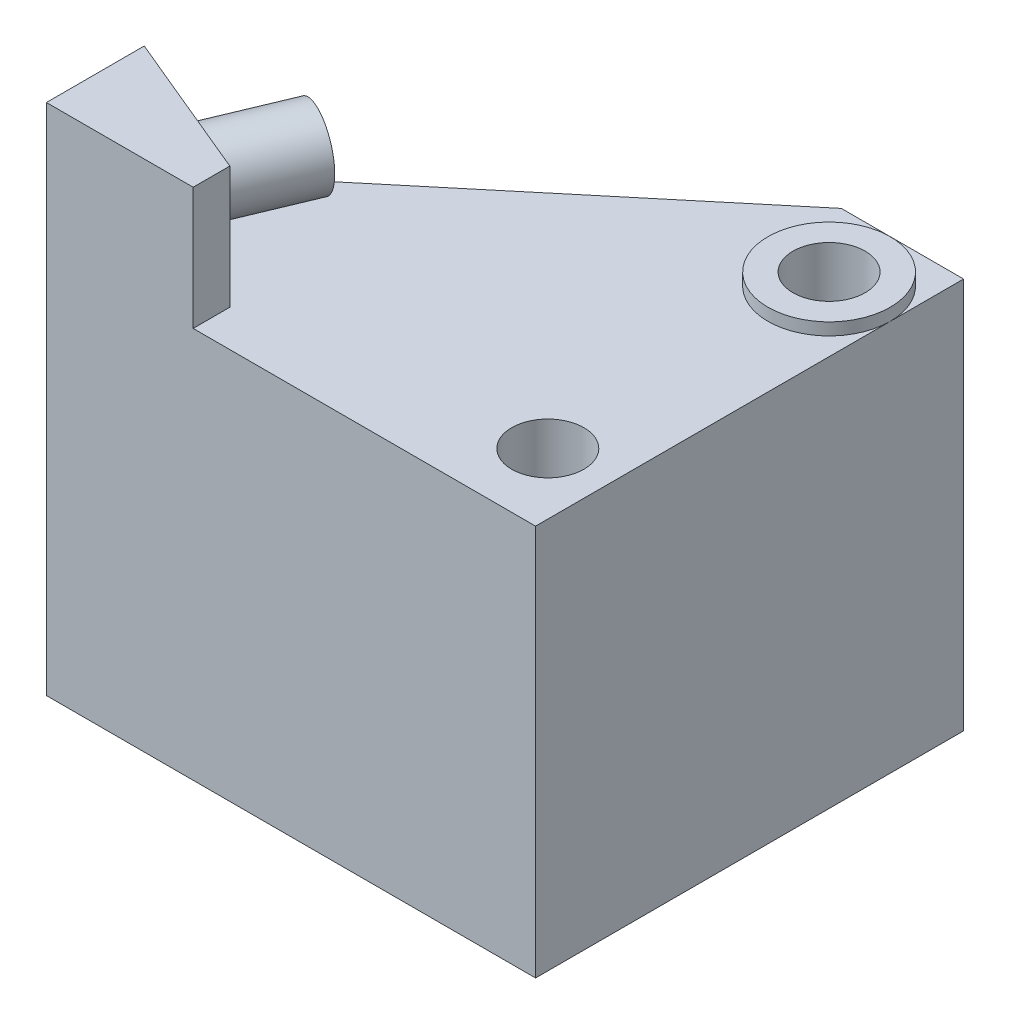
ISO-10303-21;
HEADER;
FILE_DESCRIPTION(('STEP AP214'),'2;1');
FILE_NAME('part.step','',(''),(''),'','','');
FILE_SCHEMA(('AUTOMOTIVE_DESIGN { 1 0 10303 214 1 1 1 1 }'));
ENDSEC;
DATA;
#1=APPLICATION_CONTEXT('core data for automotive mechanical design processes');
#2=APPLICATION_PROTOCOL_DEFINITION('international standard','automotive_design',2000,#1);
#3=PRODUCT_CONTEXT('',#1,'mechanical');
#4=PRODUCT('Part','Part','',(#3));
#5=PRODUCT_RELATED_PRODUCT_CATEGORY('part','',(#4));
#6=PRODUCT_DEFINITION_FORMATION('','',#4);
#7=PRODUCT_DEFINITION_CONTEXT('part definition',#1,'design');
#8=PRODUCT_DEFINITION('design','',#6,#7);
#9=PRODUCT_DEFINITION_SHAPE('','',#8);
#10=(LENGTH_UNIT() NAMED_UNIT(*) SI_UNIT(.MILLI.,.METRE.));
#11=(NAMED_UNIT(*) PLANE_ANGLE_UNIT() SI_UNIT($,.RADIAN.));
#12=(NAMED_UNIT(*) SI_UNIT($,.STERADIAN.) SOLID_ANGLE_UNIT());
#13=UNCERTAINTY_MEASURE_WITH_UNIT(LENGTH_MEASURE(1.E-05),#10,'distance_accuracy_value','');
#14=(GEOMETRIC_REPRESENTATION_CONTEXT(3) GLOBAL_UNCERTAINTY_ASSIGNED_CONTEXT((#13)) GLOBAL_UNIT_ASSIGNED_CONTEXT((#10,
#11,#12)) REPRESENTATION_CONTEXT('',''));
#15=CARTESIAN_POINT('',(0.,0.,0.));
#16=DIRECTION('',(0.,0.,1.));
#17=DIRECTION('',(1.,0.,0.));
#18=AXIS2_PLACEMENT_3D('',#15,#16,#17);
#19=CARTESIAN_POINT('',(0.,16.,0.));
#20=DIRECTION('',(0.,-1.,0.));
#21=DIRECTION('',(0.,0.,-1.));
#22=AXIS2_PLACEMENT_3D('',#19,#20,#21);
#23=PLANE('',#22);
#24=CARTESIAN_POINT('',(-2.5,16.,-3.));
#25=DIRECTION('',(0.,1.,0.));
#26=DIRECTION('',(0.,0.,1.));
#27=AXIS2_PLACEMENT_3D('',#24,#25,#26);
#28=CIRCLE('',#27,1.475);
#29=CARTESIAN_POINT('',(-2.5,16.,-1.525));
#30=VERTEX_POINT('',#29);
#31=EDGE_CURVE('E177',#30,#30,#28,.T.);
#32=ORIENTED_EDGE('',*,*,#31,.F.);
#33=EDGE_LOOP('',(#32));
#34=FACE_BOUND('',#33,.T.);
#35=DIRECTION('',(0.,0.,-1.));
#36=VECTOR('',#35,1.);
#37=CARTESIAN_POINT('',(0.,16.,-17.5));
#38=LINE('',#37,#36);
#39=CARTESIAN_POINT('',(0.,16.,0.));
#40=VERTEX_POINT('',#39);
#41=CARTESIAN_POINT('',(0.,16.,-14.5));
#42=VERTEX_POINT('',#41);
#43=EDGE_CURVE('E107',#40,#42,#38,.T.);
#44=ORIENTED_EDGE('',*,*,#43,.T.);
#45=CARTESIAN_POINT('',(-2.5,16.,-14.5));
#46=DIRECTION('',(0.,1.,0.));
#47=DIRECTION('',(0.,0.,1.));
#48=AXIS2_PLACEMENT_3D('',#45,#46,#47);
#49=CIRCLE('',#48,2.5);
#50=EDGE_CURVE('E110',#42,#42,#49,.T.);
#51=ORIENTED_EDGE('',*,*,#50,.F.);
#52=CARTESIAN_POINT('',(0.,16.,-17.5));
#53=VERTEX_POINT('',#52);
#54=EDGE_CURVE('E116',#42,#53,#38,.T.);
#55=ORIENTED_EDGE('',*,*,#54,.T.);
#56=DIRECTION('',(-1.,0.,0.));
#57=VECTOR('',#56,1.);
#58=CARTESIAN_POINT('',(-5.,16.,-17.5));
#59=LINE('',#58,#57);
#60=CARTESIAN_POINT('',(-5.,16.,-17.5));
#61=VERTEX_POINT('',#60);
#62=EDGE_CURVE('E115',#53,#61,#59,.T.);
#63=ORIENTED_EDGE('',*,*,#62,.T.);
#64=DIRECTION('',(-0.768221279597376,0.,0.64018439966448));
#65=VECTOR('',#64,1.);
#66=CARTESIAN_POINT('',(-20.,16.,-5.));
#67=LINE('',#66,#65);
#68=CARTESIAN_POINT('',(-20.,16.,-5.));
#69=VERTEX_POINT('',#68);
#70=EDGE_CURVE('E127',#61,#69,#67,.T.);
#71=ORIENTED_EDGE('',*,*,#70,.T.);
#72=DIRECTION('',(0.,0.,1.));
#73=VECTOR('',#72,1.);
#74=CARTESIAN_POINT('',(-20.,16.,0.));
#75=LINE('',#74,#73);
#76=CARTESIAN_POINT('',(-20.,16.,-4.));
#77=VERTEX_POINT('',#76);
#78=EDGE_CURVE('E62',#69,#77,#75,.T.);
#79=ORIENTED_EDGE('',*,*,#78,.T.);
#80=DIRECTION('',(-0.923076923076923,0.,-0.384615384615385));
#81=VECTOR('',#80,1.);
#82=CARTESIAN_POINT('',(-14.,16.,-1.5));
#83=LINE('',#82,#81);
#84=CARTESIAN_POINT('',(-14.,16.,-1.5));
#85=VERTEX_POINT('',#84);
#86=EDGE_CURVE('E192',#85,#77,#83,.T.);
#87=ORIENTED_EDGE('',*,*,#86,.F.);
#88=DIRECTION('',(0.,0.,-1.));
#89=VECTOR('',#88,1.);
#90=CARTESIAN_POINT('',(-14.,16.,0.));
#91=LINE('',#90,#89);
#92=CARTESIAN_POINT('',(-14.,16.,0.));
#93=VERTEX_POINT('',#92);
#94=EDGE_CURVE('E56',#93,#85,#91,.T.);
#95=ORIENTED_EDGE('',*,*,#94,.F.);
#96=DIRECTION('',(1.,0.,0.));
#97=VECTOR('',#96,1.);
#98=CARTESIAN_POINT('',(0.,16.,0.));
#99=LINE('',#98,#97);
#100=EDGE_CURVE('E111',#93,#40,#99,.T.);
#101=ORIENTED_EDGE('',*,*,#100,.T.);
#102=EDGE_LOOP('',(#44,#51,#55,#63,#71,#79,#87,#95,#101));
#103=FACE_BOUND('',#102,.T.);
#104=ADVANCED_FACE('F41',(#34,#103),#23,.F.);
#105=CARTESIAN_POINT('',(-20.,16.,0.));
#106=DIRECTION('',(1.,0.,0.));
#107=DIRECTION('',(0.,0.,-1.));
#108=AXIS2_PLACEMENT_3D('',#105,#106,#107);
#109=PLANE('',#108);
#110=DIRECTION('',(0.,0.,1.));
#111=VECTOR('',#110,1.);
#112=CARTESIAN_POINT('',(-20.,0.,0.));
#113=LINE('',#112,#111);
#114=CARTESIAN_POINT('',(-20.,0.,-5.));
#115=VERTEX_POINT('',#114);
#116=CARTESIAN_POINT('',(-20.,0.,0.));
#117=VERTEX_POINT('',#116);
#118=EDGE_CURVE('E130',#115,#117,#113,.T.);
#119=ORIENTED_EDGE('',*,*,#118,.T.);
#120=DIRECTION('',(0.,-1.,0.));
#121=VECTOR('',#120,1.);
#122=CARTESIAN_POINT('',(-20.,16.,0.));
#123=LINE('',#122,#121);
#124=CARTESIAN_POINT('',(-20.,21.,0.));
#125=VERTEX_POINT('',#124);
#126=EDGE_CURVE('E49',#125,#117,#123,.T.);
#127=ORIENTED_EDGE('',*,*,#126,.F.);
#128=DIRECTION('',(0.,0.,1.));
#129=VECTOR('',#128,1.);
#130=CARTESIAN_POINT('',(-20.,21.,-4.));
#131=LINE('',#130,#129);
#132=CARTESIAN_POINT('',(-20.,21.,-4.));
#133=VERTEX_POINT('',#132);
#134=EDGE_CURVE('E197',#133,#125,#131,.T.);
#135=ORIENTED_EDGE('',*,*,#134,.F.);
#136=DIRECTION('',(0.,-1.,0.));
#137=VECTOR('',#136,1.);
#138=CARTESIAN_POINT('',(-20.,21.,-4.));
#139=LINE('',#138,#137);
#140=EDGE_CURVE('E171',#133,#77,#139,.T.);
#141=ORIENTED_EDGE('',*,*,#140,.T.);
#142=ORIENTED_EDGE('',*,*,#78,.F.);
#143=DIRECTION('',(0.,-1.,0.));
#144=VECTOR('',#143,1.);
#145=CARTESIAN_POINT('',(-20.,16.,-5.));
#146=LINE('',#145,#144);
#147=EDGE_CURVE('E129',#69,#115,#146,.T.);
#148=ORIENTED_EDGE('',*,*,#147,.T.);
#149=EDGE_LOOP('',(#119,#127,#135,#141,#142,#148));
#150=FACE_BOUND('',#149,.T.);
#151=ADVANCED_FACE('F43',(#150),#109,.F.);
#152=CARTESIAN_POINT('',(0.,16.,0.));
#153=DIRECTION('',(0.,0.,-1.));
#154=DIRECTION('',(-1.,0.,0.));
#155=AXIS2_PLACEMENT_3D('',#152,#153,#154);
#156=PLANE('',#155);
#157=DIRECTION('',(1.,0.,0.));
#158=VECTOR('',#157,1.);
#159=CARTESIAN_POINT('',(0.,0.,0.));
#160=LINE('',#159,#158);
#161=CARTESIAN_POINT('',(0.,0.,0.));
#162=VERTEX_POINT('',#161);
#163=EDGE_CURVE('E133',#117,#162,#160,.T.);
#164=ORIENTED_EDGE('',*,*,#163,.T.);
#165=DIRECTION('',(0.,-1.,0.));
#166=VECTOR('',#165,1.);
#167=CARTESIAN_POINT('',(0.,16.,0.));
#168=LINE('',#167,#166);
#169=EDGE_CURVE('E148',#40,#162,#168,.T.);
#170=ORIENTED_EDGE('',*,*,#169,.F.);
#171=ORIENTED_EDGE('',*,*,#100,.F.);
#172=DIRECTION('',(0.,-1.,0.));
#173=VECTOR('',#172,1.);
#174=CARTESIAN_POINT('',(-14.,21.,0.));
#175=LINE('',#174,#173);
#176=CARTESIAN_POINT('',(-14.,21.,0.));
#177=VERTEX_POINT('',#176);
#178=EDGE_CURVE('E183',#177,#93,#175,.T.);
#179=ORIENTED_EDGE('',*,*,#178,.F.);
#180=DIRECTION('',(1.,0.,0.));
#181=VECTOR('',#180,1.);
#182=CARTESIAN_POINT('',(-20.,21.,0.));
#183=LINE('',#182,#181);
#184=EDGE_CURVE('E154',#125,#177,#183,.T.);
#185=ORIENTED_EDGE('',*,*,#184,.F.);
#186=ORIENTED_EDGE('',*,*,#126,.T.);
#187=EDGE_LOOP('',(#164,#170,#171,#179,#185,#186));
#188=FACE_BOUND('',#187,.T.);
#189=ADVANCED_FACE('F152',(#188),#156,.F.);
#190=CARTESIAN_POINT('',(0.,16.,-17.5));
#191=DIRECTION('',(-1.,0.,0.));
#192=DIRECTION('',(0.,0.,1.));
#193=AXIS2_PLACEMENT_3D('',#190,#191,#192);
#194=PLANE('',#193);
#195=DIRECTION('',(0.,0.,-1.));
#196=VECTOR('',#195,1.);
#197=CARTESIAN_POINT('',(0.,0.,-17.5));
#198=LINE('',#197,#196);
#199=CARTESIAN_POINT('',(0.,0.,-17.5));
#200=VERTEX_POINT('',#199);
#201=EDGE_CURVE('E136',#162,#200,#198,.T.);
#202=ORIENTED_EDGE('',*,*,#201,.T.);
#203=DIRECTION('',(0.,-1.,0.));
#204=VECTOR('',#203,1.);
#205=CARTESIAN_POINT('',(0.,16.,-17.5));
#206=LINE('',#205,#204);
#207=EDGE_CURVE('E121',#53,#200,#206,.T.);
#208=ORIENTED_EDGE('',*,*,#207,.F.);
#209=ORIENTED_EDGE('',*,*,#54,.F.);
#210=ORIENTED_EDGE('',*,*,#43,.F.);
#211=ORIENTED_EDGE('',*,*,#169,.T.);
#212=EDGE_LOOP('',(#202,#208,#209,#210,#211));
#213=FACE_BOUND('',#212,.T.);
#214=ADVANCED_FACE('F119',(#213),#194,.F.);
#215=CARTESIAN_POINT('',(-5.,16.,-17.5));
#216=DIRECTION('',(0.,0.,1.));
#217=DIRECTION('',(1.,0.,0.));
#218=AXIS2_PLACEMENT_3D('',#215,#216,#217);
#219=PLANE('',#218);
#220=DIRECTION('',(-1.,0.,0.));
#221=VECTOR('',#220,1.);
#222=CARTESIAN_POINT('',(-5.,0.,-17.5));
#223=LINE('',#222,#221);
#224=CARTESIAN_POINT('',(-5.,0.,-17.5));
#225=VERTEX_POINT('',#224);
#226=EDGE_CURVE('E138',#200,#225,#223,.T.);
#227=ORIENTED_EDGE('',*,*,#226,.T.);
#228=DIRECTION('',(0.,-1.,0.));
#229=VECTOR('',#228,1.);
#230=CARTESIAN_POINT('',(-5.,16.,-17.5));
#231=LINE('',#230,#229);
#232=EDGE_CURVE('E144',#61,#225,#231,.T.);
#233=ORIENTED_EDGE('',*,*,#232,.F.);
#234=ORIENTED_EDGE('',*,*,#62,.F.);
#235=ORIENTED_EDGE('',*,*,#207,.T.);
#236=EDGE_LOOP('',(#227,#233,#234,#235));
#237=FACE_BOUND('',#236,.T.);
#238=ADVANCED_FACE('F165',(#237),#219,.F.);
#239=CARTESIAN_POINT('',(-20.,16.,-5.));
#240=DIRECTION('',(0.64018439966448,0.,0.768221279597376));
#241=DIRECTION('',(0.768221279597376,0.,-0.64018439966448));
#242=AXIS2_PLACEMENT_3D('',#239,#240,#241);
#243=PLANE('',#242);
#244=DIRECTION('',(-0.768221279597376,0.,0.64018439966448));
#245=VECTOR('',#244,1.);
#246=CARTESIAN_POINT('',(-20.,0.,-5.));
#247=LINE('',#246,#245);
#248=EDGE_CURVE('E140',#225,#115,#247,.T.);
#249=ORIENTED_EDGE('',*,*,#248,.T.);
#250=ORIENTED_EDGE('',*,*,#147,.F.);
#251=ORIENTED_EDGE('',*,*,#70,.F.);
#252=ORIENTED_EDGE('',*,*,#232,.T.);
#253=EDGE_LOOP('',(#249,#250,#251,#252));
#254=FACE_BOUND('',#253,.T.);
#255=ADVANCED_FACE('F169',(#254),#243,.F.);
#256=CARTESIAN_POINT('',(0.,0.,0.));
#257=DIRECTION('',(0.,-1.,0.));
#258=DIRECTION('',(0.,0.,-1.));
#259=AXIS2_PLACEMENT_3D('',#256,#257,#258);
#260=PLANE('',#259);
#261=CARTESIAN_POINT('',(-2.5,0.,-14.5));
#262=DIRECTION('',(0.,1.,0.));
#263=DIRECTION('',(0.,0.,1.));
#264=AXIS2_PLACEMENT_3D('',#261,#262,#263);
#265=CIRCLE('',#264,1.475);
#266=CARTESIAN_POINT('',(-2.5,0.,-13.025));
#267=VERTEX_POINT('',#266);
#268=EDGE_CURVE('E134',#267,#267,#265,.T.);
#269=ORIENTED_EDGE('',*,*,#268,.T.);
#270=EDGE_LOOP('',(#269));
#271=FACE_BOUND('',#270,.T.);
#272=CARTESIAN_POINT('',(-2.5,0.,-3.));
#273=DIRECTION('',(0.,1.,0.));
#274=DIRECTION('',(0.,0.,1.));
#275=AXIS2_PLACEMENT_3D('',#272,#273,#274);
#276=CIRCLE('',#275,1.475);
#277=CARTESIAN_POINT('',(-2.5,0.,-1.525));
#278=VERTEX_POINT('',#277);
#279=EDGE_CURVE('E174',#278,#278,#276,.T.);
#280=ORIENTED_EDGE('',*,*,#279,.T.);
#281=EDGE_LOOP('',(#280));
#282=FACE_BOUND('',#281,.T.);
#283=ORIENTED_EDGE('',*,*,#118,.F.);
#284=ORIENTED_EDGE('',*,*,#248,.F.);
#285=ORIENTED_EDGE('',*,*,#226,.F.);
#286=ORIENTED_EDGE('',*,*,#201,.F.);
#287=ORIENTED_EDGE('',*,*,#163,.F.);
#288=EDGE_LOOP('',(#283,#284,#285,#286,#287));
#289=FACE_BOUND('',#288,.T.);
#290=ADVANCED_FACE('F161',(#271,#282,#289),#260,.T.);
#291=CARTESIAN_POINT('',(-2.5,0.,-3.));
#292=DIRECTION('',(0.,1.,0.));
#293=DIRECTION('',(0.,0.,1.));
#294=AXIS2_PLACEMENT_3D('',#291,#292,#293);
#295=CYLINDRICAL_SURFACE('',#294,1.475);
#296=ORIENTED_EDGE('',*,*,#279,.F.);
#297=EDGE_LOOP('',(#296));
#298=FACE_BOUND('',#297,.T.);
#299=ORIENTED_EDGE('',*,*,#31,.T.);
#300=EDGE_LOOP('',(#299));
#301=FACE_BOUND('',#300,.T.);
#302=ADVANCED_FACE('F253',(#298,#301),#295,.F.);
#303=CARTESIAN_POINT('',(-2.5,0.,-14.5));
#304=DIRECTION('',(0.,1.,0.));
#305=DIRECTION('',(0.,0.,1.));
#306=AXIS2_PLACEMENT_3D('',#303,#304,#305);
#307=CYLINDRICAL_SURFACE('',#306,1.475);
#308=ORIENTED_EDGE('',*,*,#268,.F.);
#309=EDGE_LOOP('',(#308));
#310=FACE_BOUND('',#309,.T.);
#311=CARTESIAN_POINT('',(-2.5,16.5,-14.5));
#312=DIRECTION('',(0.,1.,0.));
#313=DIRECTION('',(0.,0.,1.));
#314=AXIS2_PLACEMENT_3D('',#311,#312,#313);
#315=CIRCLE('',#314,1.475);
#316=CARTESIAN_POINT('',(-2.5,16.5,-13.025));
#317=VERTEX_POINT('',#316);
#318=EDGE_CURVE('E202',#317,#317,#315,.T.);
#319=ORIENTED_EDGE('',*,*,#318,.T.);
#320=EDGE_LOOP('',(#319));
#321=FACE_BOUND('',#320,.T.);
#322=ADVANCED_FACE('F224',(#310,#321),#307,.F.);
#323=CARTESIAN_POINT('',(-14.,21.,-1.5));
#324=DIRECTION('',(-0.384615384615385,0.,0.923076923076923));
#325=DIRECTION('',(0.923076923076923,0.,0.384615384615385));
#326=AXIS2_PLACEMENT_3D('',#323,#324,#325);
#327=PLANE('',#326);
#328=CARTESIAN_POINT('',(-17.,18.5,-2.75000000000001));
#329=DIRECTION('',(-0.384615384615385,0.,0.923076923076923));
#330=DIRECTION('',(0.923076923076923,0.,0.384615384615385));
#331=AXIS2_PLACEMENT_3D('',#328,#329,#330);
#332=CIRCLE('',#331,1.5);
#333=CARTESIAN_POINT('',(-15.6153846153847,18.5,-2.17307692307694));
#334=VERTEX_POINT('',#333);
#335=EDGE_CURVE('E11',#334,#334,#332,.F.);
#336=ORIENTED_EDGE('',*,*,#335,.F.);
#337=EDGE_LOOP('',(#336));
#338=FACE_BOUND('',#337,.T.);
#339=ORIENTED_EDGE('',*,*,#86,.T.);
#340=ORIENTED_EDGE('',*,*,#140,.F.);
#341=DIRECTION('',(-0.923076923076923,0.,-0.384615384615385));
#342=VECTOR('',#341,1.);
#343=CARTESIAN_POINT('',(-14.,21.,-1.5));
#344=LINE('',#343,#342);
#345=CARTESIAN_POINT('',(-14.,21.,-1.5));
#346=VERTEX_POINT('',#345);
#347=EDGE_CURVE('E191',#346,#133,#344,.T.);
#348=ORIENTED_EDGE('',*,*,#347,.F.);
#349=DIRECTION('',(0.,-1.,0.));
#350=VECTOR('',#349,1.);
#351=CARTESIAN_POINT('',(-14.,21.,-1.5));
#352=LINE('',#351,#350);
#353=EDGE_CURVE('E186',#346,#85,#352,.T.);
#354=ORIENTED_EDGE('',*,*,#353,.T.);
#355=EDGE_LOOP('',(#339,#340,#348,#354));
#356=FACE_BOUND('',#355,.T.);
#357=ADVANCED_FACE('F220',(#338,#356),#327,.F.);
#358=CARTESIAN_POINT('',(-14.,21.,0.));
#359=DIRECTION('',(-1.,0.,0.));
#360=DIRECTION('',(0.,0.,1.));
#361=AXIS2_PLACEMENT_3D('',#358,#359,#360);
#362=PLANE('',#361);
#363=ORIENTED_EDGE('',*,*,#94,.T.);
#364=ORIENTED_EDGE('',*,*,#353,.F.);
#365=DIRECTION('',(0.,0.,-1.));
#366=VECTOR('',#365,1.);
#367=CARTESIAN_POINT('',(-14.,21.,0.));
#368=LINE('',#367,#366);
#369=EDGE_CURVE('E189',#177,#346,#368,.T.);
#370=ORIENTED_EDGE('',*,*,#369,.F.);
#371=ORIENTED_EDGE('',*,*,#178,.T.);
#372=EDGE_LOOP('',(#363,#364,#370,#371));
#373=FACE_BOUND('',#372,.T.);
#374=ADVANCED_FACE('F223',(#373),#362,.F.);
#375=CARTESIAN_POINT('',(0.,21.,0.));
#376=DIRECTION('',(0.,1.,0.));
#377=DIRECTION('',(0.,0.,1.));
#378=AXIS2_PLACEMENT_3D('',#375,#376,#377);
#379=PLANE('',#378);
#380=ORIENTED_EDGE('',*,*,#347,.T.);
#381=ORIENTED_EDGE('',*,*,#134,.T.);
#382=ORIENTED_EDGE('',*,*,#184,.T.);
#383=ORIENTED_EDGE('',*,*,#369,.T.);
#384=EDGE_LOOP('',(#380,#381,#382,#383));
#385=FACE_BOUND('',#384,.T.);
#386=ADVANCED_FACE('F231',(#385),#379,.T.);
#387=CARTESIAN_POINT('',(-2.5,16.5,-14.5));
#388=DIRECTION('',(0.,1.,0.));
#389=DIRECTION('',(0.,0.,1.));
#390=AXIS2_PLACEMENT_3D('',#387,#388,#389);
#391=PLANE('',#390);
#392=CARTESIAN_POINT('',(-2.5,16.5,-14.5));
#393=DIRECTION('',(0.,1.,0.));
#394=DIRECTION('',(0.,0.,1.));
#395=AXIS2_PLACEMENT_3D('',#392,#393,#394);
#396=CIRCLE('',#395,2.5);
#397=CARTESIAN_POINT('',(-2.5,16.5,-12.));
#398=VERTEX_POINT('',#397);
#399=EDGE_CURVE('E194',#398,#398,#396,.T.);
#400=ORIENTED_EDGE('',*,*,#399,.T.);
#401=EDGE_LOOP('',(#400));
#402=FACE_BOUND('',#401,.T.);
#403=ORIENTED_EDGE('',*,*,#318,.F.);
#404=EDGE_LOOP('',(#403));
#405=FACE_BOUND('',#404,.T.);
#406=ADVANCED_FACE('F233',(#402,#405),#391,.T.);
#407=CARTESIAN_POINT('',(-2.5,16.5,-14.5));
#408=DIRECTION('',(0.,-1.,0.));
#409=DIRECTION('',(0.,0.,-1.));
#410=AXIS2_PLACEMENT_3D('',#407,#408,#409);
#411=CYLINDRICAL_SURFACE('',#410,2.5);
#412=ORIENTED_EDGE('',*,*,#399,.F.);
#413=EDGE_LOOP('',(#412));
#414=FACE_BOUND('',#413,.T.);
#415=ORIENTED_EDGE('',*,*,#50,.T.);
#416=EDGE_LOOP('',(#415));
#417=FACE_BOUND('',#416,.T.);
#418=ADVANCED_FACE('F216',(#414,#417),#411,.T.);
#419=CARTESIAN_POINT('',(-15.4615384615385,18.5,-6.44230769230771));
#420=DIRECTION('',(-0.384615384615385,0.,0.923076923076923));
#421=DIRECTION('',(0.923076923076923,0.,0.384615384615385));
#422=AXIS2_PLACEMENT_3D('',#419,#420,#421);
#423=CYLINDRICAL_SURFACE('',#422,1.5);
#424=CARTESIAN_POINT('',(-15.4615384615385,18.5,-6.44230769230771));
#425=DIRECTION('',(0.384615384615385,0.,-0.923076923076923));
#426=DIRECTION('',(-0.923076923076923,0.,-0.384615384615385));
#427=AXIS2_PLACEMENT_3D('',#424,#425,#426);
#428=CIRCLE('',#427,1.5);
#429=CARTESIAN_POINT('',(-16.8461538461539,18.5,-7.01923076923078));
#430=VERTEX_POINT('',#429);
#431=EDGE_CURVE('E207',#430,#430,#428,.T.);
#432=ORIENTED_EDGE('',*,*,#431,.F.);
#433=EDGE_LOOP('',(#432));
#434=FACE_BOUND('',#433,.T.);
#435=ORIENTED_EDGE('',*,*,#335,.T.);
#436=EDGE_LOOP('',(#435));
#437=FACE_BOUND('',#436,.T.);
#438=ADVANCED_FACE('F213',(#434,#437),#423,.T.);
#439=CARTESIAN_POINT('',(-15.4615384615385,18.5,-6.44230769230771));
#440=DIRECTION('',(0.384615384615385,0.,-0.923076923076923));
#441=DIRECTION('',(-0.923076923076923,0.,-0.384615384615385));
#442=AXIS2_PLACEMENT_3D('',#439,#440,#441);
#443=PLANE('',#442);
#444=ORIENTED_EDGE('',*,*,#431,.T.);
#445=EDGE_LOOP('',(#444));
#446=FACE_BOUND('',#445,.T.);
#447=ADVANCED_FACE('F211',(#446),#443,.T.);
#448=CLOSED_SHELL('',(#104,#151,#189,#214,#238,#255,#290,#302,#322,#357,#374,#386,#406,#418,
#438,#447));
#449=MANIFOLD_SOLID_BREP('B2',#448);
#450=ADVANCED_BREP_SHAPE_REPRESENTATION('',(#18,#449),#14);
#451=SHAPE_DEFINITION_REPRESENTATION(#9,#450);
ENDSEC;
END-ISO-10303-21;
